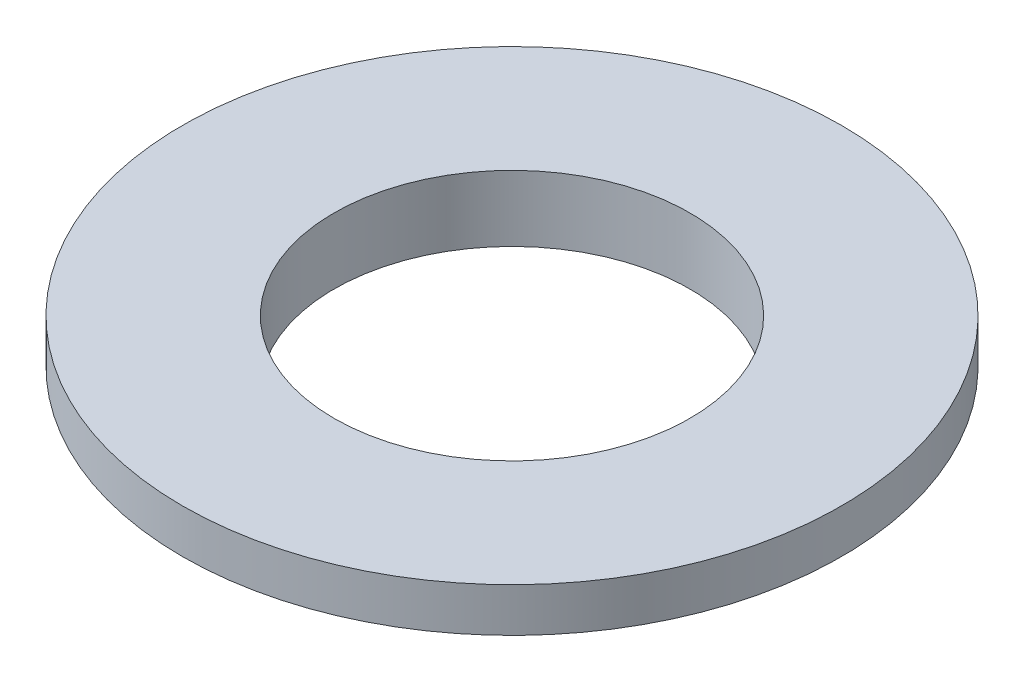
ISO-10303-21;
HEADER;
FILE_DESCRIPTION(('STEP AP214'),'2;1');
FILE_NAME('part.step','',(''),(''),'','','');
FILE_SCHEMA(('AUTOMOTIVE_DESIGN { 1 0 10303 214 1 1 1 1 }'));
ENDSEC;
DATA;
#1=APPLICATION_CONTEXT('core data for automotive mechanical design processes');
#2=APPLICATION_PROTOCOL_DEFINITION('international standard','automotive_design',2000,#1);
#3=PRODUCT_CONTEXT('',#1,'mechanical');
#4=PRODUCT('Part','Part','',(#3));
#5=PRODUCT_RELATED_PRODUCT_CATEGORY('part','',(#4));
#6=PRODUCT_DEFINITION_FORMATION('','',#4);
#7=PRODUCT_DEFINITION_CONTEXT('part definition',#1,'design');
#8=PRODUCT_DEFINITION('design','',#6,#7);
#9=PRODUCT_DEFINITION_SHAPE('','',#8);
#10=(LENGTH_UNIT() NAMED_UNIT(*) SI_UNIT(.MILLI.,.METRE.));
#11=(NAMED_UNIT(*) PLANE_ANGLE_UNIT() SI_UNIT($,.RADIAN.));
#12=(NAMED_UNIT(*) SI_UNIT($,.STERADIAN.) SOLID_ANGLE_UNIT());
#13=UNCERTAINTY_MEASURE_WITH_UNIT(LENGTH_MEASURE(1.E-05),#10,'distance_accuracy_value','');
#14=(GEOMETRIC_REPRESENTATION_CONTEXT(3) GLOBAL_UNCERTAINTY_ASSIGNED_CONTEXT((#13)) GLOBAL_UNIT_ASSIGNED_CONTEXT((#10,
#11,#12)) REPRESENTATION_CONTEXT('',''));
#15=CARTESIAN_POINT('',(0.,0.,0.));
#16=DIRECTION('',(0.,0.,1.));
#17=DIRECTION('',(1.,0.,0.));
#18=AXIS2_PLACEMENT_3D('',#15,#16,#17);
#19=CARTESIAN_POINT('',(0.,1.5,0.));
#20=DIRECTION('',(0.,-1.,0.));
#21=DIRECTION('',(0.,0.,-1.));
#22=AXIS2_PLACEMENT_3D('',#19,#20,#21);
#23=CYLINDRICAL_SURFACE('',#22,7.5);
#24=CARTESIAN_POINT('',(0.,1.5,0.));
#25=DIRECTION('',(0.,1.,0.));
#26=DIRECTION('',(0.,0.,1.));
#27=AXIS2_PLACEMENT_3D('',#24,#25,#26);
#28=CIRCLE('',#27,7.5);
#29=CARTESIAN_POINT('',(0.,1.5,7.5));
#30=VERTEX_POINT('',#29);
#31=EDGE_CURVE('E25',#30,#30,#28,.T.);
#32=ORIENTED_EDGE('',*,*,#31,.F.);
#33=EDGE_LOOP('',(#32));
#34=FACE_BOUND('',#33,.T.);
#35=CARTESIAN_POINT('',(0.,0.5,0.));
#36=DIRECTION('',(0.,1.,0.));
#37=DIRECTION('',(0.,0.,1.));
#38=AXIS2_PLACEMENT_3D('',#35,#36,#37);
#39=CIRCLE('',#38,7.5);
#40=CARTESIAN_POINT('',(0.,0.5,7.5));
#41=VERTEX_POINT('',#40);
#42=EDGE_CURVE('E11',#41,#41,#39,.T.);
#43=ORIENTED_EDGE('',*,*,#42,.T.);
#44=EDGE_LOOP('',(#43));
#45=FACE_BOUND('',#44,.T.);
#46=ADVANCED_FACE('F17',(#34,#45),#23,.T.);
#47=CARTESIAN_POINT('',(0.,0.5,0.));
#48=DIRECTION('',(0.,1.,0.));
#49=DIRECTION('',(1.,0.,0.));
#50=AXIS2_PLACEMENT_3D('',#47,#48,#49);
#51=PLANE('',#50);
#52=CARTESIAN_POINT('',(0.,0.5,0.));
#53=DIRECTION('',(0.,1.,0.));
#54=DIRECTION('',(0.,0.,1.));
#55=AXIS2_PLACEMENT_3D('',#52,#53,#54);
#56=CIRCLE('',#55,6.);
#57=CARTESIAN_POINT('',(0.,0.5,6.));
#58=VERTEX_POINT('',#57);
#59=EDGE_CURVE('E71',#58,#58,#56,.T.);
#60=ORIENTED_EDGE('',*,*,#59,.T.);
#61=EDGE_LOOP('',(#60));
#62=FACE_BOUND('',#61,.T.);
#63=ORIENTED_EDGE('',*,*,#42,.F.);
#64=EDGE_LOOP('',(#63));
#65=FACE_BOUND('',#64,.T.);
#66=ADVANCED_FACE('F145',(#62,#65),#51,.F.);
#67=CARTESIAN_POINT('',(0.,1.5,0.));
#68=DIRECTION('',(0.,1.,0.));
#69=DIRECTION('',(1.,0.,0.));
#70=AXIS2_PLACEMENT_3D('',#67,#68,#69);
#71=PLANE('',#70);
#72=CARTESIAN_POINT('',(0.,1.5,0.));
#73=DIRECTION('',(0.,1.,0.));
#74=DIRECTION('',(0.,0.,1.));
#75=AXIS2_PLACEMENT_3D('',#72,#73,#74);
#76=CIRCLE('',#75,4.05);
#77=CARTESIAN_POINT('',(0.,1.5,4.05));
#78=VERTEX_POINT('',#77);
#79=EDGE_CURVE('E75',#78,#78,#76,.T.);
#80=ORIENTED_EDGE('',*,*,#79,.F.);
#81=EDGE_LOOP('',(#80));
#82=FACE_BOUND('',#81,.T.);
#83=ORIENTED_EDGE('',*,*,#31,.T.);
#84=EDGE_LOOP('',(#83));
#85=FACE_BOUND('',#84,.T.);
#86=ADVANCED_FACE('F136',(#82,#85),#71,.T.);
#87=CARTESIAN_POINT('',(0.,0.5,0.));
#88=DIRECTION('',(0.,-1.,0.));
#89=DIRECTION('',(0.,0.,-1.));
#90=AXIS2_PLACEMENT_3D('',#87,#88,#89);
#91=CYLINDRICAL_SURFACE('',#90,4.05);
#92=CARTESIAN_POINT('',(0.,0.,0.));
#93=DIRECTION('',(0.,1.,0.));
#94=DIRECTION('',(0.,0.,1.));
#95=AXIS2_PLACEMENT_3D('',#92,#93,#94);
#96=CIRCLE('',#95,4.05);
#97=CARTESIAN_POINT('',(0.,0.,4.05));
#98=VERTEX_POINT('',#97);
#99=EDGE_CURVE('E65',#98,#98,#96,.T.);
#100=ORIENTED_EDGE('',*,*,#99,.F.);
#101=EDGE_LOOP('',(#100));
#102=FACE_BOUND('',#101,.T.);
#103=ORIENTED_EDGE('',*,*,#79,.T.);
#104=EDGE_LOOP('',(#103));
#105=FACE_BOUND('',#104,.T.);
#106=ADVANCED_FACE('F127',(#102,#105),#91,.F.);
#107=CARTESIAN_POINT('',(0.,0.5,0.));
#108=DIRECTION('',(0.,-1.,0.));
#109=DIRECTION('',(0.,0.,-1.));
#110=AXIS2_PLACEMENT_3D('',#107,#108,#109);
#111=CYLINDRICAL_SURFACE('',#110,6.);
#112=ORIENTED_EDGE('',*,*,#59,.F.);
#113=EDGE_LOOP('',(#112));
#114=FACE_BOUND('',#113,.T.);
#115=CARTESIAN_POINT('',(0.,0.,0.));
#116=DIRECTION('',(0.,1.,0.));
#117=DIRECTION('',(0.,0.,1.));
#118=AXIS2_PLACEMENT_3D('',#115,#116,#117);
#119=CIRCLE('',#118,6.);
#120=CARTESIAN_POINT('',(0.,0.,6.));
#121=VERTEX_POINT('',#120);
#122=EDGE_CURVE('E61',#121,#121,#119,.T.);
#123=ORIENTED_EDGE('',*,*,#122,.T.);
#124=EDGE_LOOP('',(#123));
#125=FACE_BOUND('',#124,.T.);
#126=ADVANCED_FACE('F62',(#114,#125),#111,.T.);
#127=CARTESIAN_POINT('',(0.,0.,0.));
#128=DIRECTION('',(0.,1.,0.));
#129=DIRECTION('',(1.,0.,0.));
#130=AXIS2_PLACEMENT_3D('',#127,#128,#129);
#131=PLANE('',#130);
#132=ORIENTED_EDGE('',*,*,#99,.T.);
#133=EDGE_LOOP('',(#132));
#134=FACE_BOUND('',#133,.T.);
#135=ORIENTED_EDGE('',*,*,#122,.F.);
#136=EDGE_LOOP('',(#135));
#137=FACE_BOUND('',#136,.T.);
#138=ADVANCED_FACE('F116',(#134,#137),#131,.F.);
#139=CLOSED_SHELL('',(#46,#66,#86,#106,#126,#138));
#140=MANIFOLD_SOLID_BREP('B1',#139);
#141=ADVANCED_BREP_SHAPE_REPRESENTATION('',(#18,#140),#14);
#142=SHAPE_DEFINITION_REPRESENTATION(#9,#141);
ENDSEC;
END-ISO-10303-21;
